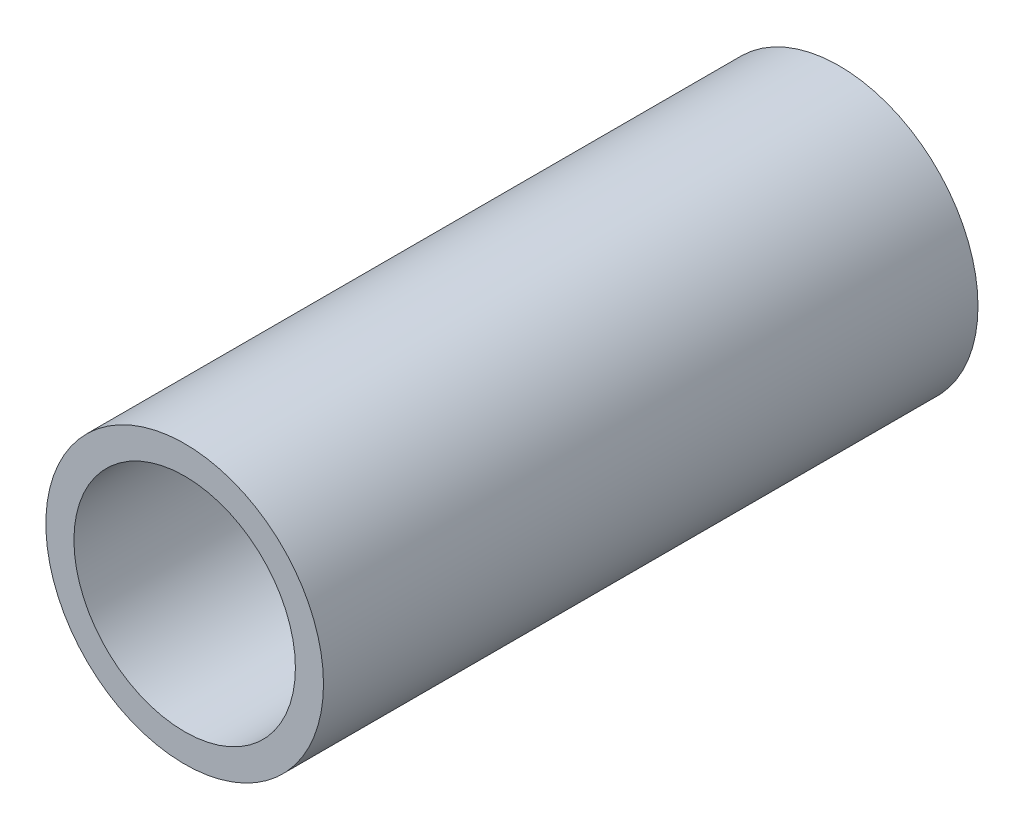
ISO-10303-21;
HEADER;
FILE_DESCRIPTION(('STEP AP214'),'2;1');
FILE_NAME('part.step','',(''),(''),'','','');
FILE_SCHEMA(('AUTOMOTIVE_DESIGN { 1 0 10303 214 1 1 1 1 }'));
ENDSEC;
DATA;
#1=APPLICATION_CONTEXT('core data for automotive mechanical design processes');
#2=APPLICATION_PROTOCOL_DEFINITION('international standard','automotive_design',2000,#1);
#3=PRODUCT_CONTEXT('',#1,'mechanical');
#4=PRODUCT('Part','Part','',(#3));
#5=PRODUCT_RELATED_PRODUCT_CATEGORY('part','',(#4));
#6=PRODUCT_DEFINITION_FORMATION('','',#4);
#7=PRODUCT_DEFINITION_CONTEXT('part definition',#1,'design');
#8=PRODUCT_DEFINITION('design','',#6,#7);
#9=PRODUCT_DEFINITION_SHAPE('','',#8);
#10=(LENGTH_UNIT() NAMED_UNIT(*) SI_UNIT(.MILLI.,.METRE.));
#11=(NAMED_UNIT(*) PLANE_ANGLE_UNIT() SI_UNIT($,.RADIAN.));
#12=(NAMED_UNIT(*) SI_UNIT($,.STERADIAN.) SOLID_ANGLE_UNIT());
#13=UNCERTAINTY_MEASURE_WITH_UNIT(LENGTH_MEASURE(1.E-05),#10,'distance_accuracy_value','');
#14=(GEOMETRIC_REPRESENTATION_CONTEXT(3) GLOBAL_UNCERTAINTY_ASSIGNED_CONTEXT((#13)) GLOBAL_UNIT_ASSIGNED_CONTEXT((#10,
#11,#12)) REPRESENTATION_CONTEXT('',''));
#15=CARTESIAN_POINT('',(0.,0.,0.));
#16=DIRECTION('',(0.,0.,1.));
#17=DIRECTION('',(1.,0.,0.));
#18=AXIS2_PLACEMENT_3D('',#15,#16,#17);
#19=CARTESIAN_POINT('',(0.,0.,39.37));
#20=DIRECTION('',(0.,0.,1.));
#21=DIRECTION('',(1.,0.,0.));
#22=AXIS2_PLACEMENT_3D('',#19,#20,#21);
#23=PLANE('',#22);
#24=CARTESIAN_POINT('',(0.,0.,39.37));
#25=DIRECTION('',(0.,0.,1.));
#26=DIRECTION('',(1.,0.,0.));
#27=AXIS2_PLACEMENT_3D('',#24,#25,#26);
#28=CIRCLE('',#27,16.7005);
#29=CARTESIAN_POINT('',(16.7005,0.,39.37));
#30=VERTEX_POINT('',#29);
#31=EDGE_CURVE('E11',#30,#30,#28,.T.);
#32=ORIENTED_EDGE('',*,*,#31,.T.);
#33=EDGE_LOOP('',(#32));
#34=FACE_BOUND('',#33,.T.);
#35=CARTESIAN_POINT('',(0.,0.,39.37));
#36=DIRECTION('',(0.,0.,1.));
#37=DIRECTION('',(1.,0.,0.));
#38=AXIS2_PLACEMENT_3D('',#35,#36,#37);
#39=CIRCLE('',#38,13.3223);
#40=CARTESIAN_POINT('',(13.3223,0.,39.37));
#41=VERTEX_POINT('',#40);
#42=EDGE_CURVE('E50',#41,#41,#39,.T.);
#43=ORIENTED_EDGE('',*,*,#42,.F.);
#44=EDGE_LOOP('',(#43));
#45=FACE_BOUND('',#44,.T.);
#46=ADVANCED_FACE('F39',(#34,#45),#23,.T.);
#47=CARTESIAN_POINT('',(0.,0.,-39.37));
#48=DIRECTION('',(0.,0.,1.));
#49=DIRECTION('',(1.,0.,0.));
#50=AXIS2_PLACEMENT_3D('',#47,#48,#49);
#51=PLANE('',#50);
#52=CARTESIAN_POINT('',(0.,0.,-39.37));
#53=DIRECTION('',(0.,0.,1.));
#54=DIRECTION('',(1.,0.,0.));
#55=AXIS2_PLACEMENT_3D('',#52,#53,#54);
#56=CIRCLE('',#55,16.7005);
#57=CARTESIAN_POINT('',(16.7005,0.,-39.37));
#58=VERTEX_POINT('',#57);
#59=EDGE_CURVE('E43',#58,#58,#56,.T.);
#60=ORIENTED_EDGE('',*,*,#59,.F.);
#61=EDGE_LOOP('',(#60));
#62=FACE_BOUND('',#61,.T.);
#63=CARTESIAN_POINT('',(0.,0.,-39.37));
#64=DIRECTION('',(0.,0.,1.));
#65=DIRECTION('',(1.,0.,0.));
#66=AXIS2_PLACEMENT_3D('',#63,#64,#65);
#67=CIRCLE('',#66,13.3223);
#68=CARTESIAN_POINT('',(13.3223,0.,-39.37));
#69=VERTEX_POINT('',#68);
#70=EDGE_CURVE('E52',#69,#69,#67,.T.);
#71=ORIENTED_EDGE('',*,*,#70,.T.);
#72=EDGE_LOOP('',(#71));
#73=FACE_BOUND('',#72,.T.);
#74=ADVANCED_FACE('F62',(#62,#73),#51,.F.);
#75=CARTESIAN_POINT('',(0.,0.,39.37));
#76=DIRECTION('',(0.,0.,-1.));
#77=DIRECTION('',(-1.,0.,0.));
#78=AXIS2_PLACEMENT_3D('',#75,#76,#77);
#79=CYLINDRICAL_SURFACE('',#78,16.7005);
#80=ORIENTED_EDGE('',*,*,#31,.F.);
#81=EDGE_LOOP('',(#80));
#82=FACE_BOUND('',#81,.T.);
#83=ORIENTED_EDGE('',*,*,#59,.T.);
#84=EDGE_LOOP('',(#83));
#85=FACE_BOUND('',#84,.T.);
#86=ADVANCED_FACE('F41',(#82,#85),#79,.T.);
#87=CARTESIAN_POINT('',(0.,0.,39.37));
#88=DIRECTION('',(0.,0.,-1.));
#89=DIRECTION('',(-1.,0.,0.));
#90=AXIS2_PLACEMENT_3D('',#87,#88,#89);
#91=CYLINDRICAL_SURFACE('',#90,13.3223);
#92=ORIENTED_EDGE('',*,*,#42,.T.);
#93=EDGE_LOOP('',(#92));
#94=FACE_BOUND('',#93,.T.);
#95=ORIENTED_EDGE('',*,*,#70,.F.);
#96=EDGE_LOOP('',(#95));
#97=FACE_BOUND('',#96,.T.);
#98=ADVANCED_FACE('F58',(#94,#97),#91,.F.);
#99=CLOSED_SHELL('',(#46,#74,#86,#98));
#100=MANIFOLD_SOLID_BREP('B2',#99);
#101=ADVANCED_BREP_SHAPE_REPRESENTATION('',(#18,#100),#14);
#102=SHAPE_DEFINITION_REPRESENTATION(#9,#101);
ENDSEC;
END-ISO-10303-21;
